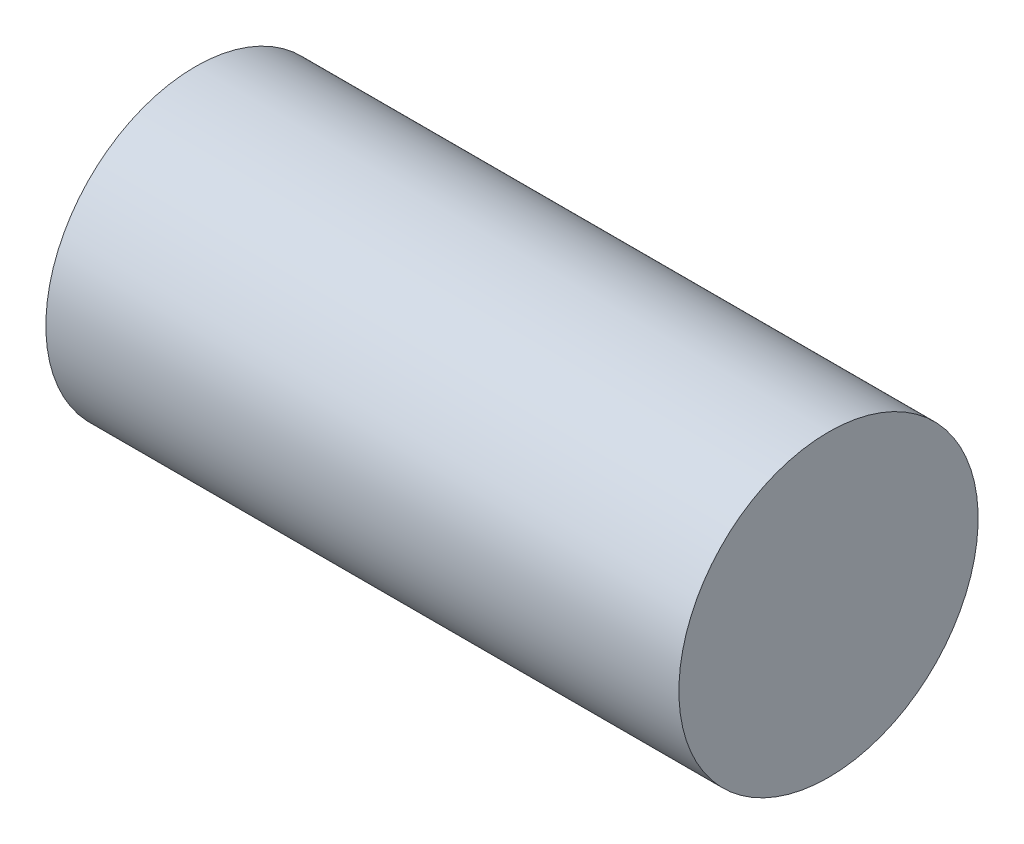
ISO-10303-21;
HEADER;
FILE_DESCRIPTION(('STEP AP214'),'2;1');
FILE_NAME('part.step','',(''),(''),'','','');
FILE_SCHEMA(('AUTOMOTIVE_DESIGN { 1 0 10303 214 1 1 1 1 }'));
ENDSEC;
DATA;
#1=APPLICATION_CONTEXT('core data for automotive mechanical design processes');
#2=APPLICATION_PROTOCOL_DEFINITION('international standard','automotive_design',2000,#1);
#3=PRODUCT_CONTEXT('',#1,'mechanical');
#4=PRODUCT('Part','Part','',(#3));
#5=PRODUCT_RELATED_PRODUCT_CATEGORY('part','',(#4));
#6=PRODUCT_DEFINITION_FORMATION('','',#4);
#7=PRODUCT_DEFINITION_CONTEXT('part definition',#1,'design');
#8=PRODUCT_DEFINITION('design','',#6,#7);
#9=PRODUCT_DEFINITION_SHAPE('','',#8);
#10=(LENGTH_UNIT() NAMED_UNIT(*) SI_UNIT(.MILLI.,.METRE.));
#11=(NAMED_UNIT(*) PLANE_ANGLE_UNIT() SI_UNIT($,.RADIAN.));
#12=(NAMED_UNIT(*) SI_UNIT($,.STERADIAN.) SOLID_ANGLE_UNIT());
#13=UNCERTAINTY_MEASURE_WITH_UNIT(LENGTH_MEASURE(1.E-05),#10,'distance_accuracy_value','');
#14=(GEOMETRIC_REPRESENTATION_CONTEXT(3) GLOBAL_UNCERTAINTY_ASSIGNED_CONTEXT((#13)) GLOBAL_UNIT_ASSIGNED_CONTEXT((#10,
#11,#12)) REPRESENTATION_CONTEXT('',''));
#15=CARTESIAN_POINT('',(0.,0.,0.));
#16=DIRECTION('',(0.,0.,1.));
#17=DIRECTION('',(1.,0.,0.));
#18=AXIS2_PLACEMENT_3D('',#15,#16,#17);
#19=CARTESIAN_POINT('',(0.,0.,0.));
#20=DIRECTION('',(-1.,0.,0.));
#21=DIRECTION('',(0.,-1.,0.));
#22=AXIS2_PLACEMENT_3D('',#19,#20,#21);
#23=PLANE('',#22);
#24=CARTESIAN_POINT('',(0.,0.,0.));
#25=DIRECTION('',(1.,0.,0.));
#26=DIRECTION('',(0.,1.,0.));
#27=AXIS2_PLACEMENT_3D('',#24,#25,#26);
#28=CIRCLE('',#27,130.);
#29=CARTESIAN_POINT('',(0.,130.,0.));
#30=VERTEX_POINT('',#29);
#31=EDGE_CURVE('E10',#30,#30,#28,.T.);
#32=ORIENTED_EDGE('',*,*,#31,.F.);
#33=EDGE_LOOP('',(#32));
#34=FACE_BOUND('',#33,.T.);
#35=ADVANCED_FACE('F36',(#34),#23,.T.);
#36=CARTESIAN_POINT('',(550.,0.,0.));
#37=DIRECTION('',(1.,0.,0.));
#38=DIRECTION('',(0.,1.,0.));
#39=AXIS2_PLACEMENT_3D('',#36,#37,#38);
#40=CYLINDRICAL_SURFACE('',#39,130.);
#41=ORIENTED_EDGE('',*,*,#31,.T.);
#42=EDGE_LOOP('',(#41));
#43=FACE_BOUND('',#42,.T.);
#44=CARTESIAN_POINT('',(550.,0.,0.));
#45=DIRECTION('',(1.,0.,0.));
#46=DIRECTION('',(0.,1.,0.));
#47=AXIS2_PLACEMENT_3D('',#44,#45,#46);
#48=CIRCLE('',#47,130.);
#49=CARTESIAN_POINT('',(550.,130.,0.));
#50=VERTEX_POINT('',#49);
#51=EDGE_CURVE('E43',#50,#50,#48,.T.);
#52=ORIENTED_EDGE('',*,*,#51,.F.);
#53=EDGE_LOOP('',(#52));
#54=FACE_BOUND('',#53,.T.);
#55=ADVANCED_FACE('F54',(#43,#54),#40,.T.);
#56=CARTESIAN_POINT('',(550.,130.,0.));
#57=DIRECTION('',(1.,0.,0.));
#58=DIRECTION('',(0.,1.,0.));
#59=AXIS2_PLACEMENT_3D('',#56,#57,#58);
#60=PLANE('',#59);
#61=ORIENTED_EDGE('',*,*,#51,.T.);
#62=EDGE_LOOP('',(#61));
#63=FACE_BOUND('',#62,.T.);
#64=ADVANCED_FACE('F52',(#63),#60,.T.);
#65=CLOSED_SHELL('',(#35,#55,#64));
#66=MANIFOLD_SOLID_BREP('B2',#65);
#67=ADVANCED_BREP_SHAPE_REPRESENTATION('',(#18,#66),#14);
#68=SHAPE_DEFINITION_REPRESENTATION(#9,#67);
ENDSEC;
END-ISO-10303-21;
